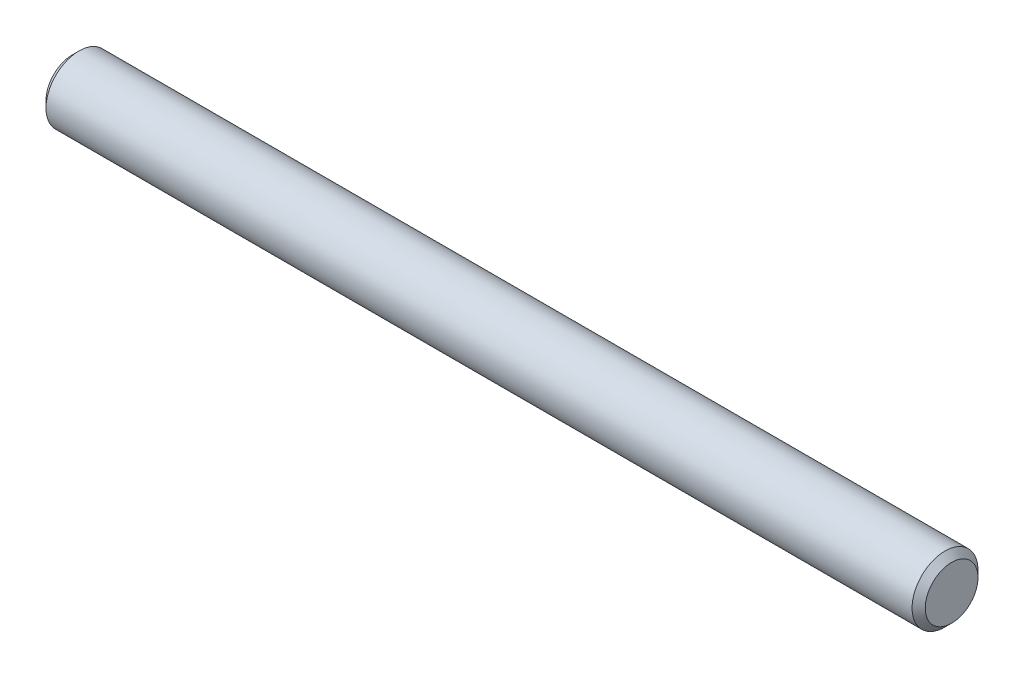
ISO-10303-21;
HEADER;
FILE_DESCRIPTION(('STEP AP214'),'2;1');
FILE_NAME('part.step','',(''),(''),'','','');
FILE_SCHEMA(('AUTOMOTIVE_DESIGN { 1 0 10303 214 1 1 1 1 }'));
ENDSEC;
DATA;
#1=APPLICATION_CONTEXT('core data for automotive mechanical design processes');
#2=APPLICATION_PROTOCOL_DEFINITION('international standard','automotive_design',2000,#1);
#3=PRODUCT_CONTEXT('',#1,'mechanical');
#4=PRODUCT('Part','Part','',(#3));
#5=PRODUCT_RELATED_PRODUCT_CATEGORY('part','',(#4));
#6=PRODUCT_DEFINITION_FORMATION('','',#4);
#7=PRODUCT_DEFINITION_CONTEXT('part definition',#1,'design');
#8=PRODUCT_DEFINITION('design','',#6,#7);
#9=PRODUCT_DEFINITION_SHAPE('','',#8);
#10=(LENGTH_UNIT() NAMED_UNIT(*) SI_UNIT(.MILLI.,.METRE.));
#11=(NAMED_UNIT(*) PLANE_ANGLE_UNIT() SI_UNIT($,.RADIAN.));
#12=(NAMED_UNIT(*) SI_UNIT($,.STERADIAN.) SOLID_ANGLE_UNIT());
#13=UNCERTAINTY_MEASURE_WITH_UNIT(LENGTH_MEASURE(1.E-05),#10,'distance_accuracy_value','');
#14=(GEOMETRIC_REPRESENTATION_CONTEXT(3) GLOBAL_UNCERTAINTY_ASSIGNED_CONTEXT((#13)) GLOBAL_UNIT_ASSIGNED_CONTEXT((#10,
#11,#12)) REPRESENTATION_CONTEXT('',''));
#15=CARTESIAN_POINT('',(0.,0.,0.));
#16=DIRECTION('',(0.,0.,1.));
#17=DIRECTION('',(1.,0.,0.));
#18=AXIS2_PLACEMENT_3D('',#15,#16,#17);
#19=CARTESIAN_POINT('',(20.,0.,0.));
#20=DIRECTION('',(-1.,0.,0.));
#21=DIRECTION('',(0.,0.,1.));
#22=AXIS2_PLACEMENT_3D('',#19,#20,#21);
#23=CYLINDRICAL_SURFACE('',#22,1.5);
#24=CARTESIAN_POINT('',(-19.7,0.,0.));
#25=DIRECTION('',(1.,0.,0.));
#26=DIRECTION('',(0.,0.,-1.));
#27=AXIS2_PLACEMENT_3D('',#24,#25,#26);
#28=CIRCLE('',#27,1.5);
#29=CARTESIAN_POINT('',(-19.7,0.,-1.5));
#30=VERTEX_POINT('',#29);
#31=EDGE_CURVE('E44',#30,#30,#28,.T.);
#32=ORIENTED_EDGE('',*,*,#31,.T.);
#33=EDGE_LOOP('',(#32));
#34=FACE_BOUND('',#33,.T.);
#35=CARTESIAN_POINT('',(19.7,0.,0.));
#36=DIRECTION('',(1.,0.,0.));
#37=DIRECTION('',(0.,0.,-1.));
#38=AXIS2_PLACEMENT_3D('',#35,#36,#37);
#39=CIRCLE('',#38,1.5);
#40=CARTESIAN_POINT('',(19.7,0.,1.5));
#41=VERTEX_POINT('',#40);
#42=EDGE_CURVE('E48',#41,#41,#39,.F.);
#43=ORIENTED_EDGE('',*,*,#42,.T.);
#44=EDGE_LOOP('',(#43));
#45=FACE_BOUND('',#44,.T.);
#46=ADVANCED_FACE('F32',(#34,#45),#23,.T.);
#47=CARTESIAN_POINT('',(20.,0.,0.));
#48=DIRECTION('',(1.,0.,0.));
#49=DIRECTION('',(0.,0.,-1.));
#50=AXIS2_PLACEMENT_3D('',#47,#48,#49);
#51=PLANE('',#50);
#52=CARTESIAN_POINT('',(20.,0.,0.));
#53=DIRECTION('',(1.,0.,0.));
#54=DIRECTION('',(0.,0.,-1.));
#55=AXIS2_PLACEMENT_3D('',#52,#53,#54);
#56=CIRCLE('',#55,1.2);
#57=CARTESIAN_POINT('',(20.,0.,1.2));
#58=VERTEX_POINT('',#57);
#59=EDGE_CURVE('E10',#58,#58,#56,.T.);
#60=ORIENTED_EDGE('',*,*,#59,.T.);
#61=EDGE_LOOP('',(#60));
#62=FACE_BOUND('',#61,.T.);
#63=ADVANCED_FACE('F64',(#62),#51,.T.);
#64=CARTESIAN_POINT('',(-20.,0.,0.));
#65=DIRECTION('',(1.,0.,0.));
#66=DIRECTION('',(0.,0.,-1.));
#67=AXIS2_PLACEMENT_3D('',#64,#65,#66);
#68=PLANE('',#67);
#69=CARTESIAN_POINT('',(-20.,0.,0.));
#70=DIRECTION('',(1.,0.,0.));
#71=DIRECTION('',(0.,0.,-1.));
#72=AXIS2_PLACEMENT_3D('',#69,#70,#71);
#73=CIRCLE('',#72,1.20000000000002);
#74=CARTESIAN_POINT('',(-20.,0.,-1.20000000000002));
#75=VERTEX_POINT('',#74);
#76=EDGE_CURVE('E40',#75,#75,#73,.F.);
#77=ORIENTED_EDGE('',*,*,#76,.T.);
#78=EDGE_LOOP('',(#77));
#79=FACE_BOUND('',#78,.T.);
#80=ADVANCED_FACE('F61',(#79),#68,.F.);
#81=CARTESIAN_POINT('',(-19.7,0.,0.));
#82=DIRECTION('',(1.,0.,0.));
#83=DIRECTION('',(0.,0.,-1.));
#84=AXIS2_PLACEMENT_3D('',#81,#82,#83);
#85=CONICAL_SURFACE('',#84,1.5,0.78539816339744);
#86=ORIENTED_EDGE('',*,*,#76,.F.);
#87=EDGE_LOOP('',(#86));
#88=FACE_BOUND('',#87,.T.);
#89=ORIENTED_EDGE('',*,*,#31,.F.);
#90=EDGE_LOOP('',(#89));
#91=FACE_BOUND('',#90,.T.);
#92=ADVANCED_FACE('F57',(#88,#91),#85,.T.);
#93=CARTESIAN_POINT('',(20.,0.,0.));
#94=DIRECTION('',(-1.,0.,0.));
#95=DIRECTION('',(0.,0.,1.));
#96=AXIS2_PLACEMENT_3D('',#93,#94,#95);
#97=CONICAL_SURFACE('',#96,1.2,0.785398163397446);
#98=CARTESIAN_POINT('',(19.7,0.,1.5));
#99=CARTESIAN_POINT('',(19.703125,0.,1.496875));
#100=CARTESIAN_POINT('',(19.70625,0.,1.49375));
#101=CARTESIAN_POINT('',(19.7125,0.,1.4875));
#102=CARTESIAN_POINT('',(19.715625,0.,1.484375));
#103=CARTESIAN_POINT('',(19.721875,0.,1.478125));
#104=CARTESIAN_POINT('',(19.725,0.,1.475));
#105=CARTESIAN_POINT('',(19.73125,0.,1.46875));
#106=CARTESIAN_POINT('',(19.734375,0.,1.465625));
#107=CARTESIAN_POINT('',(19.740625,0.,1.459375));
#108=CARTESIAN_POINT('',(19.74375,0.,1.45625));
#109=CARTESIAN_POINT('',(19.75,0.,1.45));
#110=CARTESIAN_POINT('',(19.753125,0.,1.446875));
#111=CARTESIAN_POINT('',(19.759375,0.,1.440625));
#112=CARTESIAN_POINT('',(19.7625,0.,1.4375));
#113=CARTESIAN_POINT('',(19.76875,0.,1.43125));
#114=CARTESIAN_POINT('',(19.771875,0.,1.428125));
#115=CARTESIAN_POINT('',(19.778125,0.,1.421875));
#116=CARTESIAN_POINT('',(19.78125,0.,1.41875));
#117=CARTESIAN_POINT('',(19.7875,0.,1.4125));
#118=CARTESIAN_POINT('',(19.790625,0.,1.409375));
#119=CARTESIAN_POINT('',(19.796875,0.,1.403125));
#120=CARTESIAN_POINT('',(19.8,0.,1.4));
#121=CARTESIAN_POINT('',(19.80625,0.,1.39375));
#122=CARTESIAN_POINT('',(19.809375,0.,1.390625));
#123=CARTESIAN_POINT('',(19.815625,0.,1.384375));
#124=CARTESIAN_POINT('',(19.81875,0.,1.38125));
#125=CARTESIAN_POINT('',(19.825,0.,1.375));
#126=CARTESIAN_POINT('',(19.828125,0.,1.371875));
#127=CARTESIAN_POINT('',(19.834375,0.,1.365625));
#128=CARTESIAN_POINT('',(19.8375,0.,1.3625));
#129=CARTESIAN_POINT('',(19.84375,0.,1.35625));
#130=CARTESIAN_POINT('',(19.846875,0.,1.353125));
#131=CARTESIAN_POINT('',(19.853125,0.,1.346875));
#132=CARTESIAN_POINT('',(19.85625,0.,1.34375));
#133=CARTESIAN_POINT('',(19.8625,0.,1.3375));
#134=CARTESIAN_POINT('',(19.865625,0.,1.334375));
#135=CARTESIAN_POINT('',(19.871875,0.,1.328125));
#136=CARTESIAN_POINT('',(19.875,0.,1.325));
#137=CARTESIAN_POINT('',(19.88125,0.,1.31875));
#138=CARTESIAN_POINT('',(19.884375,0.,1.315625));
#139=CARTESIAN_POINT('',(19.890625,0.,1.309375));
#140=CARTESIAN_POINT('',(19.89375,0.,1.30625));
#141=CARTESIAN_POINT('',(19.9,0.,1.3));
#142=CARTESIAN_POINT('',(19.903125,0.,1.296875));
#143=CARTESIAN_POINT('',(19.909375,0.,1.290625));
#144=CARTESIAN_POINT('',(19.9125,0.,1.2875));
#145=CARTESIAN_POINT('',(19.91875,0.,1.28125));
#146=CARTESIAN_POINT('',(19.921875,0.,1.278125));
#147=CARTESIAN_POINT('',(19.928125,0.,1.271875));
#148=CARTESIAN_POINT('',(19.93125,0.,1.26875));
#149=CARTESIAN_POINT('',(19.9375,0.,1.2625));
#150=CARTESIAN_POINT('',(19.940625,0.,1.259375));
#151=CARTESIAN_POINT('',(19.946875,0.,1.253125));
#152=CARTESIAN_POINT('',(19.95,0.,1.25));
#153=CARTESIAN_POINT('',(19.95625,0.,1.24375));
#154=CARTESIAN_POINT('',(19.959375,0.,1.240625));
#155=CARTESIAN_POINT('',(19.965625,0.,1.234375));
#156=CARTESIAN_POINT('',(19.96875,0.,1.23125));
#157=CARTESIAN_POINT('',(19.975,0.,1.225));
#158=CARTESIAN_POINT('',(19.978125,0.,1.221875));
#159=CARTESIAN_POINT('',(19.984375,0.,1.215625));
#160=CARTESIAN_POINT('',(19.9875,0.,1.2125));
#161=CARTESIAN_POINT('',(19.99375,0.,1.20625));
#162=CARTESIAN_POINT('',(19.996875,0.,1.203125));
#163=CARTESIAN_POINT('',(20.,0.,1.2));
#164=B_SPLINE_CURVE_WITH_KNOTS('',3,(#98,#99,#100,#101,#102,#103,#104,#105,#106,#107,#108,#109,
#110,#111,#112,#113,#114,#115,#116,#117,#118,#119,#120,#121,#122,#123,#124,#125,#126,#127,#128,
#129,#130,#131,#132,#133,#134,#135,#136,#137,#138,#139,#140,#141,#142,#143,#144,#145,#146,#147,
#148,#149,#150,#151,#152,#153,#154,#155,#156,#157,#158,#159,#160,#161,#162,#163),.UNSPECIFIED.,
.F.,.F.,(4,2,2,2,2,2,2,2,2,2,2,2,2,2,2,2,2,2,2,2,2,2,2,2,2,2,2,2,2,2,2,2,4),(0.,
0.0132582521472497,0.0265165042944968,0.0397747564417463,0.0530330085889935,0.0662912607362406,
0.0795495128834901,0.0928077650307373,0.106066017177984,0.119324269325234,0.132582521472481,
0.145840773619728,0.159099025766978,0.172357277914225,0.185615530061472,0.198873782208722,
0.212132034355969,0.225390286503216,0.238648538650465,0.251906790797713,0.26516504294496,
0.278423295092209,0.291681547239456,0.304939799386703,0.318198051533953,0.3314563036812,
0.344714555828447,0.357972807975697,0.371231060122944,0.384489312270191,0.397747564417441,
0.411005816564688,0.424264068711937),.UNSPECIFIED.);
#165=EDGE_CURVE('BSEAM35',#41,#58,#164,.T.);
#166=ORIENTED_EDGE('',*,*,#42,.F.);
#167=ORIENTED_EDGE('',*,*,#59,.F.);
#168=ORIENTED_EDGE('',*,*,#165,.T.);
#169=ORIENTED_EDGE('',*,*,#165,.F.);
#170=EDGE_LOOP('',(#166,#168,#167,#169));
#171=FACE_BOUND('',#170,.T.);
#172=ADVANCED_FACE('F35',(#171),#97,.T.);
#173=CLOSED_SHELL('',(#46,#63,#80,#92,#172));
#174=MANIFOLD_SOLID_BREP('B2',#173);
#175=ADVANCED_BREP_SHAPE_REPRESENTATION('',(#18,#174),#14);
#176=SHAPE_DEFINITION_REPRESENTATION(#9,#175);
ENDSEC;
END-ISO-10303-21;
